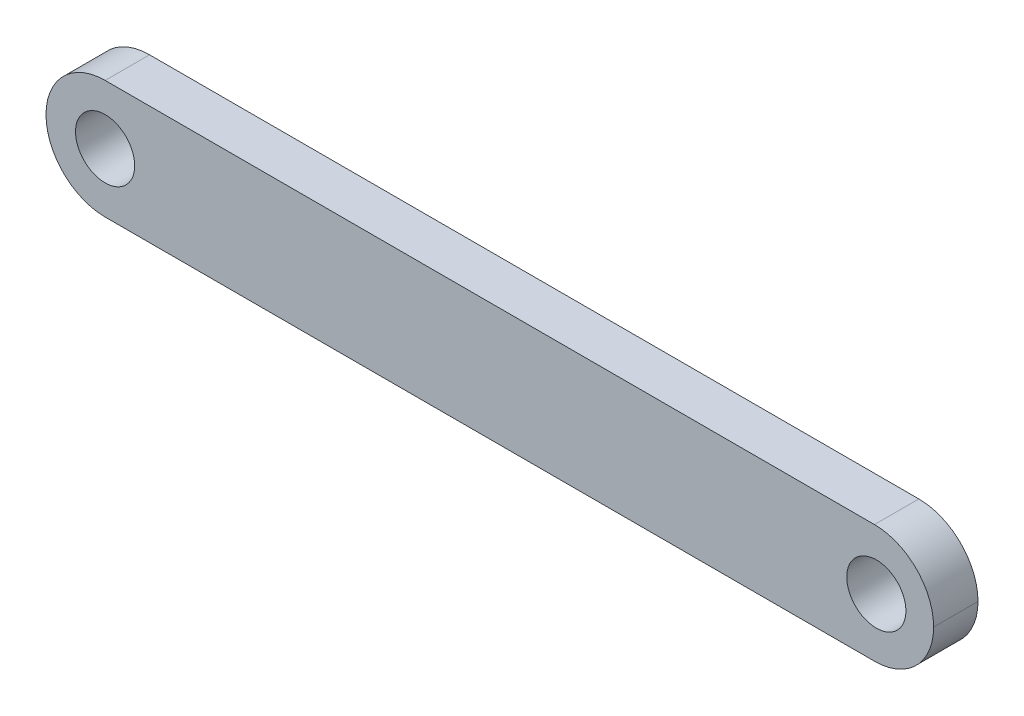
ISO-10303-21;
HEADER;
FILE_DESCRIPTION(('STEP AP214'),'2;1');
FILE_NAME('part.step','',(''),(''),'','','');
FILE_SCHEMA(('AUTOMOTIVE_DESIGN { 1 0 10303 214 1 1 1 1 }'));
ENDSEC;
DATA;
#1=APPLICATION_CONTEXT('core data for automotive mechanical design processes');
#2=APPLICATION_PROTOCOL_DEFINITION('international standard','automotive_design',2000,#1);
#3=PRODUCT_CONTEXT('',#1,'mechanical');
#4=PRODUCT('Part','Part','',(#3));
#5=PRODUCT_RELATED_PRODUCT_CATEGORY('part','',(#4));
#6=PRODUCT_DEFINITION_FORMATION('','',#4);
#7=PRODUCT_DEFINITION_CONTEXT('part definition',#1,'design');
#8=PRODUCT_DEFINITION('design','',#6,#7);
#9=PRODUCT_DEFINITION_SHAPE('','',#8);
#10=(LENGTH_UNIT() NAMED_UNIT(*) SI_UNIT(.MILLI.,.METRE.));
#11=(NAMED_UNIT(*) PLANE_ANGLE_UNIT() SI_UNIT($,.RADIAN.));
#12=(NAMED_UNIT(*) SI_UNIT($,.STERADIAN.) SOLID_ANGLE_UNIT());
#13=UNCERTAINTY_MEASURE_WITH_UNIT(LENGTH_MEASURE(1.E-05),#10,'distance_accuracy_value','');
#14=(GEOMETRIC_REPRESENTATION_CONTEXT(3) GLOBAL_UNCERTAINTY_ASSIGNED_CONTEXT((#13)) GLOBAL_UNIT_ASSIGNED_CONTEXT((#10,
#11,#12)) REPRESENTATION_CONTEXT('',''));
#15=CARTESIAN_POINT('',(0.,0.,0.));
#16=DIRECTION('',(0.,0.,1.));
#17=DIRECTION('',(1.,0.,0.));
#18=AXIS2_PLACEMENT_3D('',#15,#16,#17);
#19=CARTESIAN_POINT('',(0.,0.,3.));
#20=DIRECTION('',(0.,0.,-1.));
#21=DIRECTION('',(-1.,0.,0.));
#22=AXIS2_PLACEMENT_3D('',#19,#20,#21);
#23=PLANE('',#22);
#24=DIRECTION('',(1.,0.,0.));
#25=VECTOR('',#24,1.);
#26=CARTESIAN_POINT('',(-30.0000000000001,-4.,3.));
#27=LINE('',#26,#25);
#28=CARTESIAN_POINT('',(-26.0000000000001,-4.,3.));
#29=VERTEX_POINT('',#28);
#30=CARTESIAN_POINT('',(25.9999999999999,-3.99999999999998,3.));
#31=VERTEX_POINT('',#30);
#32=EDGE_CURVE('E139',#29,#31,#27,.T.);
#33=ORIENTED_EDGE('',*,*,#32,.T.);
#34=CARTESIAN_POINT('',(25.9999999999999,0.,3.));
#35=DIRECTION('',(0.,0.,-1.));
#36=DIRECTION('',(-1.,0.,0.));
#37=AXIS2_PLACEMENT_3D('',#34,#35,#36);
#38=CIRCLE('',#37,4.);
#39=CARTESIAN_POINT('',(29.9999999999999,0.,3.));
#40=VERTEX_POINT('',#39);
#41=EDGE_CURVE('E131',#31,#40,#38,.F.);
#42=ORIENTED_EDGE('',*,*,#41,.T.);
#43=CARTESIAN_POINT('',(25.9999999999999,0.,3.));
#44=DIRECTION('',(0.,0.,-1.));
#45=DIRECTION('',(-1.,0.,0.));
#46=AXIS2_PLACEMENT_3D('',#43,#44,#45);
#47=CIRCLE('',#46,4.);
#48=CARTESIAN_POINT('',(25.9999999999999,3.99999999999998,3.));
#49=VERTEX_POINT('',#48);
#50=EDGE_CURVE('E114',#40,#49,#47,.F.);
#51=ORIENTED_EDGE('',*,*,#50,.T.);
#52=DIRECTION('',(-1.,0.,0.));
#53=VECTOR('',#52,1.);
#54=CARTESIAN_POINT('',(-30.0000000000001,4.,3.));
#55=LINE('',#54,#53);
#56=CARTESIAN_POINT('',(-26.0000000000001,4.,3.));
#57=VERTEX_POINT('',#56);
#58=EDGE_CURVE('E143',#49,#57,#55,.T.);
#59=ORIENTED_EDGE('',*,*,#58,.T.);
#60=CARTESIAN_POINT('',(-26.0000000000001,0.,3.));
#61=DIRECTION('',(0.,0.,-1.));
#62=DIRECTION('',(-1.,0.,0.));
#63=AXIS2_PLACEMENT_3D('',#60,#61,#62);
#64=CIRCLE('',#63,4.);
#65=CARTESIAN_POINT('',(-30.0000000000001,0.,3.));
#66=VERTEX_POINT('',#65);
#67=EDGE_CURVE('E59',#57,#66,#64,.F.);
#68=ORIENTED_EDGE('',*,*,#67,.T.);
#69=CARTESIAN_POINT('',(-26.0000000000001,0.,3.));
#70=DIRECTION('',(0.,0.,-1.));
#71=DIRECTION('',(-1.,0.,0.));
#72=AXIS2_PLACEMENT_3D('',#69,#70,#71);
#73=CIRCLE('',#72,4.);
#74=EDGE_CURVE('E126',#66,#29,#73,.F.);
#75=ORIENTED_EDGE('',*,*,#74,.T.);
#76=EDGE_LOOP('',(#33,#42,#51,#59,#68,#75));
#77=FACE_BOUND('',#76,.T.);
#78=CARTESIAN_POINT('',(-26.0051042641406,0.,3.));
#79=DIRECTION('',(0.,0.,1.));
#80=DIRECTION('',(1.,0.,0.));
#81=AXIS2_PLACEMENT_3D('',#78,#79,#80);
#82=CIRCLE('',#81,2.);
#83=CARTESIAN_POINT('',(-24.0051042641406,0.,3.));
#84=VERTEX_POINT('',#83);
#85=EDGE_CURVE('E145',#84,#84,#82,.T.);
#86=ORIENTED_EDGE('',*,*,#85,.F.);
#87=EDGE_LOOP('',(#86));
#88=FACE_BOUND('',#87,.T.);
#89=CARTESIAN_POINT('',(26.1276794763986,0.,3.));
#90=DIRECTION('',(0.,0.,1.));
#91=DIRECTION('',(1.,0.,0.));
#92=AXIS2_PLACEMENT_3D('',#89,#90,#91);
#93=CIRCLE('',#92,2.);
#94=CARTESIAN_POINT('',(28.1276794763986,0.,3.));
#95=VERTEX_POINT('',#94);
#96=EDGE_CURVE('E190',#95,#95,#93,.T.);
#97=ORIENTED_EDGE('',*,*,#96,.F.);
#98=EDGE_LOOP('',(#97));
#99=FACE_BOUND('',#98,.T.);
#100=ADVANCED_FACE('F41',(#77,#88,#99),#23,.F.);
#101=CARTESIAN_POINT('',(0.,0.,0.));
#102=DIRECTION('',(0.,0.,-1.));
#103=DIRECTION('',(-1.,0.,0.));
#104=AXIS2_PLACEMENT_3D('',#101,#102,#103);
#105=PLANE('',#104);
#106=CARTESIAN_POINT('',(-26.0051042641406,0.,0.));
#107=DIRECTION('',(0.,0.,1.));
#108=DIRECTION('',(1.,0.,0.));
#109=AXIS2_PLACEMENT_3D('',#106,#107,#108);
#110=CIRCLE('',#109,2.);
#111=CARTESIAN_POINT('',(-24.0051042641406,0.,0.));
#112=VERTEX_POINT('',#111);
#113=EDGE_CURVE('E193',#112,#112,#110,.T.);
#114=ORIENTED_EDGE('',*,*,#113,.T.);
#115=EDGE_LOOP('',(#114));
#116=FACE_BOUND('',#115,.T.);
#117=CARTESIAN_POINT('',(25.9999999999999,0.,0.));
#118=DIRECTION('',(0.,0.,-1.));
#119=DIRECTION('',(-1.,0.,0.));
#120=AXIS2_PLACEMENT_3D('',#117,#118,#119);
#121=CIRCLE('',#120,4.);
#122=CARTESIAN_POINT('',(25.9999999999999,3.99999999999998,0.));
#123=VERTEX_POINT('',#122);
#124=CARTESIAN_POINT('',(29.9999999999999,0.,0.));
#125=VERTEX_POINT('',#124);
#126=EDGE_CURVE('E96',#123,#125,#121,.T.);
#127=ORIENTED_EDGE('',*,*,#126,.T.);
#128=CARTESIAN_POINT('',(25.9999999999999,0.,0.));
#129=DIRECTION('',(0.,0.,-1.));
#130=DIRECTION('',(-1.,0.,0.));
#131=AXIS2_PLACEMENT_3D('',#128,#129,#130);
#132=CIRCLE('',#131,4.);
#133=CARTESIAN_POINT('',(25.9999999999999,-3.99999999999998,0.));
#134=VERTEX_POINT('',#133);
#135=EDGE_CURVE('E105',#125,#134,#132,.T.);
#136=ORIENTED_EDGE('',*,*,#135,.T.);
#137=DIRECTION('',(1.,0.,0.));
#138=VECTOR('',#137,1.);
#139=CARTESIAN_POINT('',(-30.0000000000001,-4.,0.));
#140=LINE('',#139,#138);
#141=CARTESIAN_POINT('',(-26.0000000000001,-4.,0.));
#142=VERTEX_POINT('',#141);
#143=EDGE_CURVE('E137',#142,#134,#140,.T.);
#144=ORIENTED_EDGE('',*,*,#143,.F.);
#145=CARTESIAN_POINT('',(-26.0000000000001,0.,0.));
#146=DIRECTION('',(0.,0.,-1.));
#147=DIRECTION('',(-1.,0.,0.));
#148=AXIS2_PLACEMENT_3D('',#145,#146,#147);
#149=CIRCLE('',#148,4.);
#150=CARTESIAN_POINT('',(-30.0000000000001,0.,0.));
#151=VERTEX_POINT('',#150);
#152=EDGE_CURVE('E110',#142,#151,#149,.T.);
#153=ORIENTED_EDGE('',*,*,#152,.T.);
#154=CARTESIAN_POINT('',(-26.0000000000001,0.,0.));
#155=DIRECTION('',(0.,0.,-1.));
#156=DIRECTION('',(-1.,0.,0.));
#157=AXIS2_PLACEMENT_3D('',#154,#155,#156);
#158=CIRCLE('',#157,4.);
#159=CARTESIAN_POINT('',(-26.0000000000001,4.,0.));
#160=VERTEX_POINT('',#159);
#161=EDGE_CURVE('E146',#151,#160,#158,.T.);
#162=ORIENTED_EDGE('',*,*,#161,.T.);
#163=DIRECTION('',(-1.,0.,0.));
#164=VECTOR('',#163,1.);
#165=CARTESIAN_POINT('',(-30.0000000000001,4.,0.));
#166=LINE('',#165,#164);
#167=EDGE_CURVE('E102',#123,#160,#166,.T.);
#168=ORIENTED_EDGE('',*,*,#167,.F.);
#169=EDGE_LOOP('',(#127,#136,#144,#153,#162,#168));
#170=FACE_BOUND('',#169,.T.);
#171=CARTESIAN_POINT('',(26.1276794763986,0.,0.));
#172=DIRECTION('',(0.,0.,1.));
#173=DIRECTION('',(1.,0.,0.));
#174=AXIS2_PLACEMENT_3D('',#171,#172,#173);
#175=CIRCLE('',#174,2.);
#176=CARTESIAN_POINT('',(28.1276794763986,0.,0.));
#177=VERTEX_POINT('',#176);
#178=EDGE_CURVE('E113',#177,#177,#175,.T.);
#179=ORIENTED_EDGE('',*,*,#178,.T.);
#180=EDGE_LOOP('',(#179));
#181=FACE_BOUND('',#180,.T.);
#182=ADVANCED_FACE('F98',(#116,#170,#181),#105,.T.);
#183=CARTESIAN_POINT('',(-30.0000000000001,4.,3.));
#184=DIRECTION('',(0.,-1.,0.));
#185=DIRECTION('',(1.,0.,0.));
#186=AXIS2_PLACEMENT_3D('',#183,#184,#185);
#187=PLANE('',#186);
#188=ORIENTED_EDGE('',*,*,#58,.F.);
#189=DIRECTION('',(0.,0.,-1.));
#190=VECTOR('',#189,1.);
#191=CARTESIAN_POINT('',(25.9999999999999,3.99999999999998,3.));
#192=LINE('',#191,#190);
#193=EDGE_CURVE('E11',#49,#123,#192,.T.);
#194=ORIENTED_EDGE('',*,*,#193,.T.);
#195=ORIENTED_EDGE('',*,*,#167,.T.);
#196=DIRECTION('',(0.,0.,-1.));
#197=VECTOR('',#196,1.);
#198=CARTESIAN_POINT('',(-26.0000000000001,4.,3.));
#199=LINE('',#198,#197);
#200=EDGE_CURVE('E49',#160,#57,#199,.F.);
#201=ORIENTED_EDGE('',*,*,#200,.T.);
#202=EDGE_LOOP('',(#188,#194,#195,#201));
#203=FACE_BOUND('',#202,.T.);
#204=ADVANCED_FACE('F167',(#203),#187,.F.);
#205=CARTESIAN_POINT('',(-30.0000000000001,-4.,3.));
#206=DIRECTION('',(0.,1.,0.));
#207=DIRECTION('',(-1.,0.,0.));
#208=AXIS2_PLACEMENT_3D('',#205,#206,#207);
#209=PLANE('',#208);
#210=ORIENTED_EDGE('',*,*,#143,.T.);
#211=DIRECTION('',(0.,0.,-1.));
#212=VECTOR('',#211,1.);
#213=CARTESIAN_POINT('',(25.9999999999999,-3.99999999999998,3.));
#214=LINE('',#213,#212);
#215=EDGE_CURVE('E118',#134,#31,#214,.F.);
#216=ORIENTED_EDGE('',*,*,#215,.T.);
#217=ORIENTED_EDGE('',*,*,#32,.F.);
#218=DIRECTION('',(0.,0.,-1.));
#219=VECTOR('',#218,1.);
#220=CARTESIAN_POINT('',(-26.0000000000001,-4.,3.));
#221=LINE('',#220,#219);
#222=EDGE_CURVE('E120',#29,#142,#221,.T.);
#223=ORIENTED_EDGE('',*,*,#222,.T.);
#224=EDGE_LOOP('',(#210,#216,#217,#223));
#225=FACE_BOUND('',#224,.T.);
#226=ADVANCED_FACE('F140',(#225),#209,.F.);
#227=CARTESIAN_POINT('',(-26.0051042641406,0.,3.));
#228=DIRECTION('',(0.,0.,-1.));
#229=DIRECTION('',(-1.,0.,0.));
#230=AXIS2_PLACEMENT_3D('',#227,#228,#229);
#231=CYLINDRICAL_SURFACE('',#230,2.);
#232=ORIENTED_EDGE('',*,*,#85,.T.);
#233=EDGE_LOOP('',(#232));
#234=FACE_BOUND('',#233,.T.);
#235=ORIENTED_EDGE('',*,*,#113,.F.);
#236=EDGE_LOOP('',(#235));
#237=FACE_BOUND('',#236,.T.);
#238=ADVANCED_FACE('F168',(#234,#237),#231,.F.);
#239=CARTESIAN_POINT('',(26.1276794763986,0.,3.));
#240=DIRECTION('',(0.,0.,-1.));
#241=DIRECTION('',(-1.,0.,0.));
#242=AXIS2_PLACEMENT_3D('',#239,#240,#241);
#243=CYLINDRICAL_SURFACE('',#242,2.);
#244=ORIENTED_EDGE('',*,*,#96,.T.);
#245=EDGE_LOOP('',(#244));
#246=FACE_BOUND('',#245,.T.);
#247=ORIENTED_EDGE('',*,*,#178,.F.);
#248=EDGE_LOOP('',(#247));
#249=FACE_BOUND('',#248,.T.);
#250=ADVANCED_FACE('F178',(#246,#249),#243,.F.);
#251=CARTESIAN_POINT('',(25.9999999999999,0.,3.));
#252=DIRECTION('',(0.,0.,-1.));
#253=DIRECTION('',(-1.,0.,0.));
#254=AXIS2_PLACEMENT_3D('',#251,#252,#253);
#255=CYLINDRICAL_SURFACE('',#254,4.);
#256=ORIENTED_EDGE('',*,*,#193,.F.);
#257=ORIENTED_EDGE('',*,*,#50,.F.);
#258=DIRECTION('',(0.,0.,-1.));
#259=VECTOR('',#258,1.);
#260=CARTESIAN_POINT('',(29.9999999999999,0.,3.));
#261=LINE('',#260,#259);
#262=EDGE_CURVE('E112',#125,#40,#261,.F.);
#263=ORIENTED_EDGE('',*,*,#262,.F.);
#264=ORIENTED_EDGE('',*,*,#126,.F.);
#265=EDGE_LOOP('',(#256,#257,#263,#264));
#266=FACE_BOUND('',#265,.T.);
#267=ADVANCED_FACE('F115',(#266),#255,.T.);
#268=CARTESIAN_POINT('',(25.9999999999999,0.,3.));
#269=DIRECTION('',(0.,0.,-1.));
#270=DIRECTION('',(-1.,0.,0.));
#271=AXIS2_PLACEMENT_3D('',#268,#269,#270);
#272=CYLINDRICAL_SURFACE('',#271,4.);
#273=ORIENTED_EDGE('',*,*,#41,.F.);
#274=ORIENTED_EDGE('',*,*,#215,.F.);
#275=ORIENTED_EDGE('',*,*,#135,.F.);
#276=ORIENTED_EDGE('',*,*,#262,.T.);
#277=EDGE_LOOP('',(#273,#274,#275,#276));
#278=FACE_BOUND('',#277,.T.);
#279=ADVANCED_FACE('F117',(#278),#272,.T.);
#280=CARTESIAN_POINT('',(-26.0000000000001,0.,3.));
#281=DIRECTION('',(0.,0.,-1.));
#282=DIRECTION('',(-1.,0.,0.));
#283=AXIS2_PLACEMENT_3D('',#280,#281,#282);
#284=CYLINDRICAL_SURFACE('',#283,4.);
#285=DIRECTION('',(0.,0.,-1.));
#286=VECTOR('',#285,1.);
#287=CARTESIAN_POINT('',(-30.0000000000001,0.,3.));
#288=LINE('',#287,#286);
#289=EDGE_CURVE('E44',#66,#151,#288,.T.);
#290=ORIENTED_EDGE('',*,*,#289,.F.);
#291=ORIENTED_EDGE('',*,*,#67,.F.);
#292=ORIENTED_EDGE('',*,*,#200,.F.);
#293=ORIENTED_EDGE('',*,*,#161,.F.);
#294=EDGE_LOOP('',(#290,#291,#292,#293));
#295=FACE_BOUND('',#294,.T.);
#296=ADVANCED_FACE('F43',(#295),#284,.T.);
#297=CARTESIAN_POINT('',(-26.0000000000001,0.,3.));
#298=DIRECTION('',(0.,0.,-1.));
#299=DIRECTION('',(-1.,0.,0.));
#300=AXIS2_PLACEMENT_3D('',#297,#298,#299);
#301=CYLINDRICAL_SURFACE('',#300,4.);
#302=ORIENTED_EDGE('',*,*,#74,.F.);
#303=ORIENTED_EDGE('',*,*,#289,.T.);
#304=ORIENTED_EDGE('',*,*,#152,.F.);
#305=ORIENTED_EDGE('',*,*,#222,.F.);
#306=EDGE_LOOP('',(#302,#303,#304,#305));
#307=FACE_BOUND('',#306,.T.);
#308=ADVANCED_FACE('F152',(#307),#301,.T.);
#309=CLOSED_SHELL('',(#100,#182,#204,#226,#238,#250,#267,#279,#296,#308));
#310=MANIFOLD_SOLID_BREP('B2',#309);
#311=ADVANCED_BREP_SHAPE_REPRESENTATION('',(#18,#310),#14);
#312=SHAPE_DEFINITION_REPRESENTATION(#9,#311);
ENDSEC;
END-ISO-10303-21;
